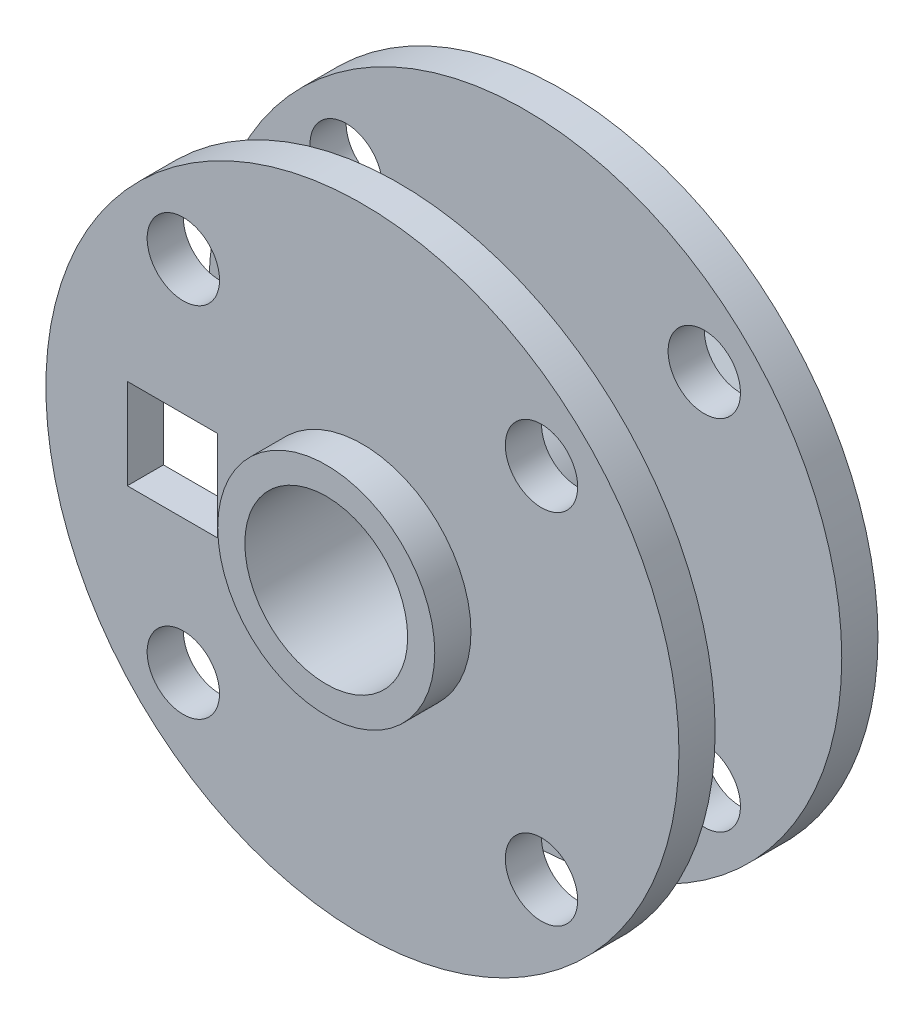
ISO-10303-21;
HEADER;
FILE_DESCRIPTION(('STEP AP214'),'2;1');
FILE_NAME('part.step','',(''),(''),'','','');
FILE_SCHEMA(('AUTOMOTIVE_DESIGN { 1 0 10303 214 1 1 1 1 }'));
ENDSEC;
DATA;
#1=APPLICATION_CONTEXT('core data for automotive mechanical design processes');
#2=APPLICATION_PROTOCOL_DEFINITION('international standard','automotive_design',2000,#1);
#3=PRODUCT_CONTEXT('',#1,'mechanical');
#4=PRODUCT('Part','Part','',(#3));
#5=PRODUCT_RELATED_PRODUCT_CATEGORY('part','',(#4));
#6=PRODUCT_DEFINITION_FORMATION('','',#4);
#7=PRODUCT_DEFINITION_CONTEXT('part definition',#1,'design');
#8=PRODUCT_DEFINITION('design','',#6,#7);
#9=PRODUCT_DEFINITION_SHAPE('','',#8);
#10=(LENGTH_UNIT() NAMED_UNIT(*) SI_UNIT(.MILLI.,.METRE.));
#11=(NAMED_UNIT(*) PLANE_ANGLE_UNIT() SI_UNIT($,.RADIAN.));
#12=(NAMED_UNIT(*) SI_UNIT($,.STERADIAN.) SOLID_ANGLE_UNIT());
#13=UNCERTAINTY_MEASURE_WITH_UNIT(LENGTH_MEASURE(1.E-05),#10,'distance_accuracy_value','');
#14=(GEOMETRIC_REPRESENTATION_CONTEXT(3) GLOBAL_UNCERTAINTY_ASSIGNED_CONTEXT((#13)) GLOBAL_UNIT_ASSIGNED_CONTEXT((#10,
#11,#12)) REPRESENTATION_CONTEXT('',''));
#15=CARTESIAN_POINT('',(0.,0.,0.));
#16=DIRECTION('',(0.,0.,1.));
#17=DIRECTION('',(1.,0.,0.));
#18=AXIS2_PLACEMENT_3D('',#15,#16,#17);
#19=CARTESIAN_POINT('',(0.,0.,0.));
#20=DIRECTION('',(0.,0.,1.));
#21=DIRECTION('',(1.,0.,0.));
#22=AXIS2_PLACEMENT_3D('',#19,#20,#21);
#23=PLANE('',#22);
#24=CARTESIAN_POINT('',(0.,0.,0.));
#25=DIRECTION('',(0.,0.,1.));
#26=DIRECTION('',(1.,0.,0.));
#27=AXIS2_PLACEMENT_3D('',#24,#25,#26);
#28=CIRCLE('',#27,17.5);
#29=CARTESIAN_POINT('',(17.5,0.,0.));
#30=VERTEX_POINT('',#29);
#31=EDGE_CURVE('E270',#30,#30,#28,.T.);
#32=ORIENTED_EDGE('',*,*,#31,.F.);
#33=EDGE_LOOP('',(#32));
#34=FACE_BOUND('',#33,.T.);
#35=DIRECTION('',(-1.,0.,0.));
#36=VECTOR('',#35,1.);
#37=CARTESIAN_POINT('',(0.,2.5,0.));
#38=LINE('',#37,#36);
#39=CARTESIAN_POINT('',(-8.,2.5,0.));
#40=VERTEX_POINT('',#39);
#41=CARTESIAN_POINT('',(-13.,2.5,0.));
#42=VERTEX_POINT('',#41);
#43=EDGE_CURVE('E251',#40,#42,#38,.T.);
#44=ORIENTED_EDGE('',*,*,#43,.T.);
#45=DIRECTION('',(0.,-1.,0.));
#46=VECTOR('',#45,1.);
#47=CARTESIAN_POINT('',(-13.,0.,0.));
#48=LINE('',#47,#46);
#49=CARTESIAN_POINT('',(-13.,-2.5,0.));
#50=VERTEX_POINT('',#49);
#51=EDGE_CURVE('E256',#42,#50,#48,.T.);
#52=ORIENTED_EDGE('',*,*,#51,.T.);
#53=DIRECTION('',(1.,0.,0.));
#54=VECTOR('',#53,1.);
#55=CARTESIAN_POINT('',(0.,-2.5,0.));
#56=LINE('',#55,#54);
#57=CARTESIAN_POINT('',(-8.,-2.5,0.));
#58=VERTEX_POINT('',#57);
#59=EDGE_CURVE('E241',#50,#58,#56,.T.);
#60=ORIENTED_EDGE('',*,*,#59,.T.);
#61=DIRECTION('',(0.,1.,0.));
#62=VECTOR('',#61,1.);
#63=CARTESIAN_POINT('',(-8.,0.,0.));
#64=LINE('',#63,#62);
#65=EDGE_CURVE('E246',#58,#40,#64,.T.);
#66=ORIENTED_EDGE('',*,*,#65,.T.);
#67=EDGE_LOOP('',(#44,#52,#60,#66));
#68=FACE_BOUND('',#67,.T.);
#69=CARTESIAN_POINT('',(-9.89949493661169,9.89949493661164,0.));
#70=DIRECTION('',(0.,0.,1.));
#71=DIRECTION('',(1.,0.,0.));
#72=AXIS2_PLACEMENT_3D('',#69,#70,#71);
#73=CIRCLE('',#72,2.);
#74=CARTESIAN_POINT('',(-7.89949493661168,9.89949493661164,0.));
#75=VERTEX_POINT('',#74);
#76=EDGE_CURVE('E183',#75,#75,#73,.T.);
#77=ORIENTED_EDGE('',*,*,#76,.T.);
#78=EDGE_LOOP('',(#77));
#79=FACE_BOUND('',#78,.T.);
#80=CARTESIAN_POINT('',(9.89949493661165,9.89949493661224,0.));
#81=DIRECTION('',(0.,0.,1.));
#82=DIRECTION('',(1.,0.,0.));
#83=AXIS2_PLACEMENT_3D('',#80,#81,#82);
#84=CIRCLE('',#83,2.00000000000058);
#85=CARTESIAN_POINT('',(11.8994949366122,9.89949493661224,0.));
#86=VERTEX_POINT('',#85);
#87=EDGE_CURVE('E190',#86,#86,#84,.T.);
#88=ORIENTED_EDGE('',*,*,#87,.T.);
#89=EDGE_LOOP('',(#88));
#90=FACE_BOUND('',#89,.T.);
#91=CARTESIAN_POINT('',(9.89949493661224,-9.89949493661109,0.));
#92=DIRECTION('',(0.,0.,1.));
#93=DIRECTION('',(1.,0.,0.));
#94=AXIS2_PLACEMENT_3D('',#91,#92,#93);
#95=CIRCLE('',#94,2.00000000000078);
#96=CARTESIAN_POINT('',(11.899494936613,-9.89949493661109,0.));
#97=VERTEX_POINT('',#96);
#98=EDGE_CURVE('E197',#97,#97,#95,.T.);
#99=ORIENTED_EDGE('',*,*,#98,.T.);
#100=EDGE_LOOP('',(#99));
#101=FACE_BOUND('',#100,.T.);
#102=CARTESIAN_POINT('',(-9.89949493661109,-9.89949493661169,0.));
#103=DIRECTION('',(0.,0.,1.));
#104=DIRECTION('',(1.,0.,0.));
#105=AXIS2_PLACEMENT_3D('',#102,#103,#104);
#106=CIRCLE('',#105,2.0000000000003);
#107=CARTESIAN_POINT('',(-7.89949493661079,-9.89949493661169,0.));
#108=VERTEX_POINT('',#107);
#109=EDGE_CURVE('E204',#108,#108,#106,.T.);
#110=ORIENTED_EDGE('',*,*,#109,.T.);
#111=EDGE_LOOP('',(#110));
#112=FACE_BOUND('',#111,.T.);
#113=CARTESIAN_POINT('',(0.,0.,0.));
#114=DIRECTION('',(0.,0.,1.));
#115=DIRECTION('',(1.,0.,0.));
#116=AXIS2_PLACEMENT_3D('',#113,#114,#115);
#117=CIRCLE('',#116,6.);
#118=CARTESIAN_POINT('',(6.,0.,0.));
#119=VERTEX_POINT('',#118);
#120=EDGE_CURVE('E11',#119,#119,#117,.F.);
#121=ORIENTED_EDGE('',*,*,#120,.F.);
#122=EDGE_LOOP('',(#121));
#123=FACE_BOUND('',#122,.T.);
#124=ADVANCED_FACE('F36',(#34,#68,#79,#90,#101,#112,#123),#23,.F.);
#125=CARTESIAN_POINT('',(0.,0.,11.));
#126=DIRECTION('',(0.,0.,1.));
#127=DIRECTION('',(1.,0.,0.));
#128=AXIS2_PLACEMENT_3D('',#125,#126,#127);
#129=PLANE('',#128);
#130=CARTESIAN_POINT('',(-9.89949493661109,-9.89949493661169,11.));
#131=DIRECTION('',(0.,0.,1.));
#132=DIRECTION('',(1.,0.,0.));
#133=AXIS2_PLACEMENT_3D('',#130,#131,#132);
#134=CIRCLE('',#133,2.0000000000003);
#135=CARTESIAN_POINT('',(-7.89949493661079,-9.89949493661169,11.));
#136=VERTEX_POINT('',#135);
#137=EDGE_CURVE('E165',#136,#136,#134,.T.);
#138=ORIENTED_EDGE('',*,*,#137,.F.);
#139=EDGE_LOOP('',(#138));
#140=FACE_BOUND('',#139,.T.);
#141=CARTESIAN_POINT('',(9.89949493661224,-9.89949493661109,11.));
#142=DIRECTION('',(0.,0.,1.));
#143=DIRECTION('',(1.,0.,0.));
#144=AXIS2_PLACEMENT_3D('',#141,#142,#143);
#145=CIRCLE('',#144,2.00000000000078);
#146=CARTESIAN_POINT('',(11.899494936613,-9.89949493661109,11.));
#147=VERTEX_POINT('',#146);
#148=EDGE_CURVE('E175',#147,#147,#145,.T.);
#149=ORIENTED_EDGE('',*,*,#148,.F.);
#150=EDGE_LOOP('',(#149));
#151=FACE_BOUND('',#150,.T.);
#152=CARTESIAN_POINT('',(9.89949493661165,9.89949493661224,11.));
#153=DIRECTION('',(0.,0.,1.));
#154=DIRECTION('',(1.,0.,0.));
#155=AXIS2_PLACEMENT_3D('',#152,#153,#154);
#156=CIRCLE('',#155,2.00000000000058);
#157=CARTESIAN_POINT('',(11.8994949366122,9.89949493661224,11.));
#158=VERTEX_POINT('',#157);
#159=EDGE_CURVE('E171',#158,#158,#156,.T.);
#160=ORIENTED_EDGE('',*,*,#159,.F.);
#161=EDGE_LOOP('',(#160));
#162=FACE_BOUND('',#161,.T.);
#163=CARTESIAN_POINT('',(-9.89949493661169,9.89949493661164,11.));
#164=DIRECTION('',(0.,0.,1.));
#165=DIRECTION('',(1.,0.,0.));
#166=AXIS2_PLACEMENT_3D('',#163,#164,#165);
#167=CIRCLE('',#166,2.);
#168=CARTESIAN_POINT('',(-7.89949493661168,9.89949493661164,11.));
#169=VERTEX_POINT('',#168);
#170=EDGE_CURVE('E174',#169,#169,#167,.T.);
#171=ORIENTED_EDGE('',*,*,#170,.F.);
#172=EDGE_LOOP('',(#171));
#173=FACE_BOUND('',#172,.T.);
#174=CARTESIAN_POINT('',(0.,0.,11.));
#175=DIRECTION('',(0.,0.,1.));
#176=DIRECTION('',(1.,0.,0.));
#177=AXIS2_PLACEMENT_3D('',#174,#175,#176);
#178=CIRCLE('',#177,17.5);
#179=CARTESIAN_POINT('',(17.5,0.,11.));
#180=VERTEX_POINT('',#179);
#181=EDGE_CURVE('E262',#180,#180,#178,.T.);
#182=ORIENTED_EDGE('',*,*,#181,.T.);
#183=EDGE_LOOP('',(#182));
#184=FACE_BOUND('',#183,.T.);
#185=DIRECTION('',(0.,-1.,0.));
#186=VECTOR('',#185,1.);
#187=CARTESIAN_POINT('',(-13.,2.5,11.));
#188=LINE('',#187,#186);
#189=CARTESIAN_POINT('',(-13.,2.5,11.));
#190=VERTEX_POINT('',#189);
#191=CARTESIAN_POINT('',(-13.,-2.5,11.));
#192=VERTEX_POINT('',#191);
#193=EDGE_CURVE('E217',#190,#192,#188,.T.);
#194=ORIENTED_EDGE('',*,*,#193,.F.);
#195=DIRECTION('',(-1.,0.,0.));
#196=VECTOR('',#195,1.);
#197=CARTESIAN_POINT('',(-13.,2.5,11.));
#198=LINE('',#197,#196);
#199=CARTESIAN_POINT('',(-8.,2.5,11.));
#200=VERTEX_POINT('',#199);
#201=EDGE_CURVE('E227',#200,#190,#198,.T.);
#202=ORIENTED_EDGE('',*,*,#201,.F.);
#203=DIRECTION('',(0.,1.,0.));
#204=VECTOR('',#203,1.);
#205=CARTESIAN_POINT('',(-8.,2.5,11.));
#206=LINE('',#205,#204);
#207=CARTESIAN_POINT('',(-8.,-2.5,11.));
#208=VERTEX_POINT('',#207);
#209=EDGE_CURVE('E224',#208,#200,#206,.T.);
#210=ORIENTED_EDGE('',*,*,#209,.F.);
#211=DIRECTION('',(1.,0.,0.));
#212=VECTOR('',#211,1.);
#213=CARTESIAN_POINT('',(-13.,-2.5,11.));
#214=LINE('',#213,#212);
#215=EDGE_CURVE('E221',#192,#208,#214,.T.);
#216=ORIENTED_EDGE('',*,*,#215,.F.);
#217=EDGE_LOOP('',(#194,#202,#210,#216));
#218=FACE_BOUND('',#217,.T.);
#219=CARTESIAN_POINT('',(0.,0.,11.));
#220=DIRECTION('',(0.,0.,1.));
#221=DIRECTION('',(1.,0.,0.));
#222=AXIS2_PLACEMENT_3D('',#219,#220,#221);
#223=CIRCLE('',#222,6.);
#224=CARTESIAN_POINT('',(6.,0.,11.));
#225=VERTEX_POINT('',#224);
#226=EDGE_CURVE('E213',#225,#225,#223,.T.);
#227=ORIENTED_EDGE('',*,*,#226,.F.);
#228=EDGE_LOOP('',(#227));
#229=FACE_BOUND('',#228,.T.);
#230=ADVANCED_FACE('F324',(#140,#151,#162,#173,#184,#218,#229),#129,.T.);
#231=CARTESIAN_POINT('',(0.,0.,2.));
#232=DIRECTION('',(0.,0.,-1.));
#233=DIRECTION('',(-1.,0.,0.));
#234=AXIS2_PLACEMENT_3D('',#231,#232,#233);
#235=CYLINDRICAL_SURFACE('',#234,17.5);
#236=CARTESIAN_POINT('',(0.,0.,2.));
#237=DIRECTION('',(0.,0.,1.));
#238=DIRECTION('',(1.,0.,0.));
#239=AXIS2_PLACEMENT_3D('',#236,#237,#238);
#240=CIRCLE('',#239,17.5);
#241=CARTESIAN_POINT('',(17.5,0.,2.));
#242=VERTEX_POINT('',#241);
#243=EDGE_CURVE('E275',#242,#242,#240,.T.);
#244=ORIENTED_EDGE('',*,*,#243,.F.);
#245=EDGE_LOOP('',(#244));
#246=FACE_BOUND('',#245,.T.);
#247=ORIENTED_EDGE('',*,*,#31,.T.);
#248=EDGE_LOOP('',(#247));
#249=FACE_BOUND('',#248,.T.);
#250=ADVANCED_FACE('F38',(#246,#249),#235,.T.);
#251=CARTESIAN_POINT('',(0.,0.,2.));
#252=DIRECTION('',(0.,0.,1.));
#253=DIRECTION('',(1.,0.,0.));
#254=AXIS2_PLACEMENT_3D('',#251,#252,#253);
#255=PLANE('',#254);
#256=CARTESIAN_POINT('',(-9.89949493661109,-9.89949493661169,2.));
#257=DIRECTION('',(0.,0.,1.));
#258=DIRECTION('',(1.,0.,0.));
#259=AXIS2_PLACEMENT_3D('',#256,#257,#258);
#260=CIRCLE('',#259,2.0000000000003);
#261=CARTESIAN_POINT('',(-7.89949493661079,-9.89949493661169,2.));
#262=VERTEX_POINT('',#261);
#263=EDGE_CURVE('E207',#262,#262,#260,.T.);
#264=ORIENTED_EDGE('',*,*,#263,.F.);
#265=EDGE_LOOP('',(#264));
#266=FACE_BOUND('',#265,.T.);
#267=CARTESIAN_POINT('',(9.89949493661224,-9.89949493661109,2.));
#268=DIRECTION('',(0.,0.,1.));
#269=DIRECTION('',(1.,0.,0.));
#270=AXIS2_PLACEMENT_3D('',#267,#268,#269);
#271=CIRCLE('',#270,2.00000000000078);
#272=CARTESIAN_POINT('',(11.899494936613,-9.89949493661109,2.));
#273=VERTEX_POINT('',#272);
#274=EDGE_CURVE('E200',#273,#273,#271,.T.);
#275=ORIENTED_EDGE('',*,*,#274,.F.);
#276=EDGE_LOOP('',(#275));
#277=FACE_BOUND('',#276,.T.);
#278=CARTESIAN_POINT('',(9.89949493661165,9.89949493661224,2.));
#279=DIRECTION('',(0.,0.,1.));
#280=DIRECTION('',(1.,0.,0.));
#281=AXIS2_PLACEMENT_3D('',#278,#279,#280);
#282=CIRCLE('',#281,2.00000000000058);
#283=CARTESIAN_POINT('',(11.8994949366122,9.89949493661224,2.));
#284=VERTEX_POINT('',#283);
#285=EDGE_CURVE('E193',#284,#284,#282,.T.);
#286=ORIENTED_EDGE('',*,*,#285,.F.);
#287=EDGE_LOOP('',(#286));
#288=FACE_BOUND('',#287,.T.);
#289=CARTESIAN_POINT('',(-9.89949493661169,9.89949493661164,2.));
#290=DIRECTION('',(0.,0.,1.));
#291=DIRECTION('',(1.,0.,0.));
#292=AXIS2_PLACEMENT_3D('',#289,#290,#291);
#293=CIRCLE('',#292,2.);
#294=CARTESIAN_POINT('',(-7.89949493661168,9.89949493661164,2.));
#295=VERTEX_POINT('',#294);
#296=EDGE_CURVE('E186',#295,#295,#293,.T.);
#297=ORIENTED_EDGE('',*,*,#296,.F.);
#298=EDGE_LOOP('',(#297));
#299=FACE_BOUND('',#298,.T.);
#300=DIRECTION('',(0.,-1.,0.));
#301=VECTOR('',#300,1.);
#302=CARTESIAN_POINT('',(-13.,0.,2.));
#303=LINE('',#302,#301);
#304=CARTESIAN_POINT('',(-13.,2.5,2.));
#305=VERTEX_POINT('',#304);
#306=CARTESIAN_POINT('',(-13.,-2.5,2.));
#307=VERTEX_POINT('',#306);
#308=EDGE_CURVE('E259',#305,#307,#303,.T.);
#309=ORIENTED_EDGE('',*,*,#308,.F.);
#310=DIRECTION('',(-1.,0.,0.));
#311=VECTOR('',#310,1.);
#312=CARTESIAN_POINT('',(0.,2.5,2.));
#313=LINE('',#312,#311);
#314=CARTESIAN_POINT('',(-8.,2.5,2.));
#315=VERTEX_POINT('',#314);
#316=EDGE_CURVE('E254',#315,#305,#313,.T.);
#317=ORIENTED_EDGE('',*,*,#316,.F.);
#318=DIRECTION('',(0.,1.,0.));
#319=VECTOR('',#318,1.);
#320=CARTESIAN_POINT('',(-8.,0.,2.));
#321=LINE('',#320,#319);
#322=CARTESIAN_POINT('',(-8.,-2.5,2.));
#323=VERTEX_POINT('',#322);
#324=EDGE_CURVE('E249',#323,#315,#321,.T.);
#325=ORIENTED_EDGE('',*,*,#324,.F.);
#326=DIRECTION('',(1.,0.,0.));
#327=VECTOR('',#326,1.);
#328=CARTESIAN_POINT('',(0.,-2.5,2.));
#329=LINE('',#328,#327);
#330=EDGE_CURVE('E244',#307,#323,#329,.T.);
#331=ORIENTED_EDGE('',*,*,#330,.F.);
#332=EDGE_LOOP('',(#309,#317,#325,#331));
#333=FACE_BOUND('',#332,.T.);
#334=CARTESIAN_POINT('',(0.,0.,2.));
#335=DIRECTION('',(0.,0.,1.));
#336=DIRECTION('',(1.,0.,0.));
#337=AXIS2_PLACEMENT_3D('',#334,#335,#336);
#338=CIRCLE('',#337,7.);
#339=CARTESIAN_POINT('',(7.,0.,2.));
#340=VERTEX_POINT('',#339);
#341=EDGE_CURVE('E271',#340,#340,#338,.T.);
#342=ORIENTED_EDGE('',*,*,#341,.F.);
#343=EDGE_LOOP('',(#342));
#344=FACE_BOUND('',#343,.T.);
#345=ORIENTED_EDGE('',*,*,#243,.T.);
#346=EDGE_LOOP('',(#345));
#347=FACE_BOUND('',#346,.T.);
#348=ADVANCED_FACE('F334',(#266,#277,#288,#299,#333,#344,#347),#255,.T.);
#349=CARTESIAN_POINT('',(0.,0.,9.));
#350=DIRECTION('',(0.,0.,-1.));
#351=DIRECTION('',(-1.,0.,0.));
#352=AXIS2_PLACEMENT_3D('',#349,#350,#351);
#353=CYLINDRICAL_SURFACE('',#352,7.);
#354=CARTESIAN_POINT('',(0.,0.,9.));
#355=DIRECTION('',(0.,0.,1.));
#356=DIRECTION('',(1.,0.,0.));
#357=AXIS2_PLACEMENT_3D('',#354,#355,#356);
#358=CIRCLE('',#357,7.);
#359=CARTESIAN_POINT('',(7.,0.,9.));
#360=VERTEX_POINT('',#359);
#361=EDGE_CURVE('E265',#360,#360,#358,.T.);
#362=ORIENTED_EDGE('',*,*,#361,.F.);
#363=EDGE_LOOP('',(#362));
#364=FACE_BOUND('',#363,.T.);
#365=ORIENTED_EDGE('',*,*,#341,.T.);
#366=EDGE_LOOP('',(#365));
#367=FACE_BOUND('',#366,.T.);
#368=ADVANCED_FACE('F337',(#364,#367),#353,.T.);
#369=CARTESIAN_POINT('',(0.,0.,11.));
#370=DIRECTION('',(0.,0.,-1.));
#371=DIRECTION('',(-1.,0.,0.));
#372=AXIS2_PLACEMENT_3D('',#369,#370,#371);
#373=CYLINDRICAL_SURFACE('',#372,17.5);
#374=ORIENTED_EDGE('',*,*,#181,.F.);
#375=EDGE_LOOP('',(#374));
#376=FACE_BOUND('',#375,.T.);
#377=CARTESIAN_POINT('',(0.,0.,9.));
#378=DIRECTION('',(0.,0.,1.));
#379=DIRECTION('',(1.,0.,0.));
#380=AXIS2_PLACEMENT_3D('',#377,#378,#379);
#381=CIRCLE('',#380,17.5);
#382=CARTESIAN_POINT('',(17.5,0.,9.));
#383=VERTEX_POINT('',#382);
#384=EDGE_CURVE('E261',#383,#383,#381,.T.);
#385=ORIENTED_EDGE('',*,*,#384,.T.);
#386=EDGE_LOOP('',(#385));
#387=FACE_BOUND('',#386,.T.);
#388=ADVANCED_FACE('F341',(#376,#387),#373,.T.);
#389=CARTESIAN_POINT('',(0.,0.,9.));
#390=DIRECTION('',(0.,0.,1.));
#391=DIRECTION('',(1.,0.,0.));
#392=AXIS2_PLACEMENT_3D('',#389,#390,#391);
#393=PLANE('',#392);
#394=CARTESIAN_POINT('',(-9.89949493661109,-9.89949493661169,9.));
#395=DIRECTION('',(0.,0.,1.));
#396=DIRECTION('',(1.,0.,0.));
#397=AXIS2_PLACEMENT_3D('',#394,#395,#396);
#398=CIRCLE('',#397,2.0000000000003);
#399=CARTESIAN_POINT('',(-7.89949493661079,-9.89949493661169,9.));
#400=VERTEX_POINT('',#399);
#401=EDGE_CURVE('E203',#400,#400,#398,.T.);
#402=ORIENTED_EDGE('',*,*,#401,.T.);
#403=EDGE_LOOP('',(#402));
#404=FACE_BOUND('',#403,.T.);
#405=CARTESIAN_POINT('',(9.89949493661224,-9.89949493661109,9.));
#406=DIRECTION('',(0.,0.,1.));
#407=DIRECTION('',(1.,0.,0.));
#408=AXIS2_PLACEMENT_3D('',#405,#406,#407);
#409=CIRCLE('',#408,2.00000000000078);
#410=CARTESIAN_POINT('',(11.899494936613,-9.89949493661109,9.));
#411=VERTEX_POINT('',#410);
#412=EDGE_CURVE('E196',#411,#411,#409,.T.);
#413=ORIENTED_EDGE('',*,*,#412,.T.);
#414=EDGE_LOOP('',(#413));
#415=FACE_BOUND('',#414,.T.);
#416=CARTESIAN_POINT('',(9.89949493661165,9.89949493661224,9.));
#417=DIRECTION('',(0.,0.,1.));
#418=DIRECTION('',(1.,0.,0.));
#419=AXIS2_PLACEMENT_3D('',#416,#417,#418);
#420=CIRCLE('',#419,2.00000000000058);
#421=CARTESIAN_POINT('',(11.8994949366122,9.89949493661224,9.));
#422=VERTEX_POINT('',#421);
#423=EDGE_CURVE('E189',#422,#422,#420,.T.);
#424=ORIENTED_EDGE('',*,*,#423,.T.);
#425=EDGE_LOOP('',(#424));
#426=FACE_BOUND('',#425,.T.);
#427=CARTESIAN_POINT('',(-9.89949493661169,9.89949493661164,9.));
#428=DIRECTION('',(0.,0.,1.));
#429=DIRECTION('',(1.,0.,0.));
#430=AXIS2_PLACEMENT_3D('',#427,#428,#429);
#431=CIRCLE('',#430,2.);
#432=CARTESIAN_POINT('',(-7.89949493661168,9.89949493661164,9.));
#433=VERTEX_POINT('',#432);
#434=EDGE_CURVE('E182',#433,#433,#431,.T.);
#435=ORIENTED_EDGE('',*,*,#434,.T.);
#436=EDGE_LOOP('',(#435));
#437=FACE_BOUND('',#436,.T.);
#438=DIRECTION('',(-1.,0.,0.));
#439=VECTOR('',#438,1.);
#440=CARTESIAN_POINT('',(0.,2.5,9.));
#441=LINE('',#440,#439);
#442=CARTESIAN_POINT('',(-8.,2.5,9.));
#443=VERTEX_POINT('',#442);
#444=CARTESIAN_POINT('',(-13.,2.5,9.));
#445=VERTEX_POINT('',#444);
#446=EDGE_CURVE('E285',#443,#445,#441,.T.);
#447=ORIENTED_EDGE('',*,*,#446,.T.);
#448=DIRECTION('',(0.,-1.,0.));
#449=VECTOR('',#448,1.);
#450=CARTESIAN_POINT('',(-13.,0.,9.));
#451=LINE('',#450,#449);
#452=CARTESIAN_POINT('',(-13.,-2.5,9.));
#453=VERTEX_POINT('',#452);
#454=EDGE_CURVE('E44',#445,#453,#451,.T.);
#455=ORIENTED_EDGE('',*,*,#454,.T.);
#456=DIRECTION('',(1.,0.,0.));
#457=VECTOR('',#456,1.);
#458=CARTESIAN_POINT('',(0.,-2.5,9.));
#459=LINE('',#458,#457);
#460=CARTESIAN_POINT('',(-8.,-2.5,9.));
#461=VERTEX_POINT('',#460);
#462=EDGE_CURVE('E274',#453,#461,#459,.T.);
#463=ORIENTED_EDGE('',*,*,#462,.T.);
#464=DIRECTION('',(0.,1.,0.));
#465=VECTOR('',#464,1.);
#466=CARTESIAN_POINT('',(-8.,0.,9.));
#467=LINE('',#466,#465);
#468=EDGE_CURVE('E282',#461,#443,#467,.T.);
#469=ORIENTED_EDGE('',*,*,#468,.T.);
#470=EDGE_LOOP('',(#447,#455,#463,#469));
#471=FACE_BOUND('',#470,.T.);
#472=ORIENTED_EDGE('',*,*,#361,.T.);
#473=EDGE_LOOP('',(#472));
#474=FACE_BOUND('',#473,.T.);
#475=ORIENTED_EDGE('',*,*,#384,.F.);
#476=EDGE_LOOP('',(#475));
#477=FACE_BOUND('',#476,.T.);
#478=ADVANCED_FACE('F298',(#404,#415,#426,#437,#471,#474,#477),#393,.F.);
#479=CARTESIAN_POINT('',(-13.,-2.5,-7.));
#480=DIRECTION('',(0.,-1.,0.));
#481=DIRECTION('',(1.,0.,0.));
#482=AXIS2_PLACEMENT_3D('',#479,#480,#481);
#483=PLANE('',#482);
#484=DIRECTION('',(0.,0.,1.));
#485=VECTOR('',#484,1.);
#486=CARTESIAN_POINT('',(-13.,-2.5,-7.));
#487=LINE('',#486,#485);
#488=EDGE_CURVE('E230',#453,#192,#487,.T.);
#489=ORIENTED_EDGE('',*,*,#488,.T.);
#490=ORIENTED_EDGE('',*,*,#215,.T.);
#491=DIRECTION('',(0.,0.,1.));
#492=VECTOR('',#491,1.);
#493=CARTESIAN_POINT('',(-8.,-2.5,-7.));
#494=LINE('',#493,#492);
#495=EDGE_CURVE('E237',#461,#208,#494,.T.);
#496=ORIENTED_EDGE('',*,*,#495,.F.);
#497=ORIENTED_EDGE('',*,*,#462,.F.);
#498=EDGE_LOOP('',(#489,#490,#496,#497));
#499=FACE_BOUND('',#498,.T.);
#500=ADVANCED_FACE('F347',(#499),#483,.F.);
#501=CARTESIAN_POINT('',(-8.,2.5,-7.));
#502=DIRECTION('',(1.,0.,0.));
#503=DIRECTION('',(0.,0.,-1.));
#504=AXIS2_PLACEMENT_3D('',#501,#502,#503);
#505=PLANE('',#504);
#506=ORIENTED_EDGE('',*,*,#495,.T.);
#507=ORIENTED_EDGE('',*,*,#209,.T.);
#508=DIRECTION('',(0.,0.,1.));
#509=VECTOR('',#508,1.);
#510=CARTESIAN_POINT('',(-8.,2.5,-7.));
#511=LINE('',#510,#509);
#512=EDGE_CURVE('E235',#443,#200,#511,.T.);
#513=ORIENTED_EDGE('',*,*,#512,.F.);
#514=ORIENTED_EDGE('',*,*,#468,.F.);
#515=EDGE_LOOP('',(#506,#507,#513,#514));
#516=FACE_BOUND('',#515,.T.);
#517=ADVANCED_FACE('F363',(#516),#505,.F.);
#518=CARTESIAN_POINT('',(-13.,2.5,-7.));
#519=DIRECTION('',(0.,1.,0.));
#520=DIRECTION('',(0.,0.,1.));
#521=AXIS2_PLACEMENT_3D('',#518,#519,#520);
#522=PLANE('',#521);
#523=ORIENTED_EDGE('',*,*,#512,.T.);
#524=ORIENTED_EDGE('',*,*,#201,.T.);
#525=DIRECTION('',(0.,0.,1.));
#526=VECTOR('',#525,1.);
#527=CARTESIAN_POINT('',(-13.,2.5,-7.));
#528=LINE('',#527,#526);
#529=EDGE_CURVE('E231',#445,#190,#528,.T.);
#530=ORIENTED_EDGE('',*,*,#529,.F.);
#531=ORIENTED_EDGE('',*,*,#446,.F.);
#532=EDGE_LOOP('',(#523,#524,#530,#531));
#533=FACE_BOUND('',#532,.T.);
#534=ADVANCED_FACE('F367',(#533),#522,.F.);
#535=CARTESIAN_POINT('',(-13.,2.5,-7.));
#536=DIRECTION('',(-1.,0.,0.));
#537=DIRECTION('',(0.,0.,1.));
#538=AXIS2_PLACEMENT_3D('',#535,#536,#537);
#539=PLANE('',#538);
#540=ORIENTED_EDGE('',*,*,#529,.T.);
#541=ORIENTED_EDGE('',*,*,#193,.T.);
#542=ORIENTED_EDGE('',*,*,#488,.F.);
#543=ORIENTED_EDGE('',*,*,#454,.F.);
#544=EDGE_LOOP('',(#540,#541,#542,#543));
#545=FACE_BOUND('',#544,.T.);
#546=ADVANCED_FACE('F353',(#545),#539,.F.);
#547=ORIENTED_EDGE('',*,*,#308,.T.);
#548=EDGE_CURVE('E51',#50,#307,#487,.T.);
#549=ORIENTED_EDGE('',*,*,#548,.F.);
#550=ORIENTED_EDGE('',*,*,#51,.F.);
#551=EDGE_CURVE('E233',#42,#305,#528,.T.);
#552=ORIENTED_EDGE('',*,*,#551,.T.);
#553=EDGE_LOOP('',(#547,#549,#550,#552));
#554=FACE_BOUND('',#553,.T.);
#555=ADVANCED_FACE('F349',(#554),#539,.F.);
#556=ORIENTED_EDGE('',*,*,#316,.T.);
#557=ORIENTED_EDGE('',*,*,#551,.F.);
#558=ORIENTED_EDGE('',*,*,#43,.F.);
#559=EDGE_CURVE('E234',#40,#315,#511,.T.);
#560=ORIENTED_EDGE('',*,*,#559,.T.);
#561=EDGE_LOOP('',(#556,#557,#558,#560));
#562=FACE_BOUND('',#561,.T.);
#563=ADVANCED_FACE('F352',(#562),#522,.F.);
#564=ORIENTED_EDGE('',*,*,#324,.T.);
#565=ORIENTED_EDGE('',*,*,#559,.F.);
#566=ORIENTED_EDGE('',*,*,#65,.F.);
#567=EDGE_CURVE('E56',#58,#323,#494,.T.);
#568=ORIENTED_EDGE('',*,*,#567,.T.);
#569=EDGE_LOOP('',(#564,#565,#566,#568));
#570=FACE_BOUND('',#569,.T.);
#571=ADVANCED_FACE('F359',(#570),#505,.F.);
#572=ORIENTED_EDGE('',*,*,#330,.T.);
#573=ORIENTED_EDGE('',*,*,#567,.F.);
#574=ORIENTED_EDGE('',*,*,#59,.F.);
#575=ORIENTED_EDGE('',*,*,#548,.T.);
#576=EDGE_LOOP('',(#572,#573,#574,#575));
#577=FACE_BOUND('',#576,.T.);
#578=ADVANCED_FACE('F355',(#577),#483,.F.);
#579=CARTESIAN_POINT('',(0.,0.,18.));
#580=DIRECTION('',(0.,0.,-1.));
#581=DIRECTION('',(-1.,0.,0.));
#582=AXIS2_PLACEMENT_3D('',#579,#580,#581);
#583=CYLINDRICAL_SURFACE('',#582,4.5);
#584=CARTESIAN_POINT('',(0.,0.,13.));
#585=DIRECTION('',(0.,0.,1.));
#586=DIRECTION('',(1.,0.,0.));
#587=AXIS2_PLACEMENT_3D('',#584,#585,#586);
#588=CIRCLE('',#587,4.5);
#589=CARTESIAN_POINT('',(4.5,0.,13.));
#590=VERTEX_POINT('',#589);
#591=EDGE_CURVE('E210',#590,#590,#588,.T.);
#592=ORIENTED_EDGE('',*,*,#591,.T.);
#593=EDGE_LOOP('',(#592));
#594=FACE_BOUND('',#593,.T.);
#595=CARTESIAN_POINT('',(0.,0.,-5.));
#596=DIRECTION('',(0.,0.,-1.));
#597=DIRECTION('',(-1.,0.,0.));
#598=AXIS2_PLACEMENT_3D('',#595,#596,#597);
#599=CIRCLE('',#598,4.5);
#600=CARTESIAN_POINT('',(-4.5,0.,-5.));
#601=VERTEX_POINT('',#600);
#602=EDGE_CURVE('E386',#601,#601,#599,.T.);
#603=ORIENTED_EDGE('',*,*,#602,.T.);
#604=EDGE_LOOP('',(#603));
#605=FACE_BOUND('',#604,.T.);
#606=ADVANCED_FACE('F358',(#594,#605),#583,.F.);
#607=CARTESIAN_POINT('',(0.,0.,13.));
#608=DIRECTION('',(0.,0.,1.));
#609=DIRECTION('',(1.,0.,0.));
#610=AXIS2_PLACEMENT_3D('',#607,#608,#609);
#611=PLANE('',#610);
#612=CARTESIAN_POINT('',(0.,0.,13.));
#613=DIRECTION('',(0.,0.,1.));
#614=DIRECTION('',(1.,0.,0.));
#615=AXIS2_PLACEMENT_3D('',#612,#613,#614);
#616=CIRCLE('',#615,6.);
#617=CARTESIAN_POINT('',(6.,0.,13.));
#618=VERTEX_POINT('',#617);
#619=EDGE_CURVE('E214',#618,#618,#616,.T.);
#620=ORIENTED_EDGE('',*,*,#619,.T.);
#621=EDGE_LOOP('',(#620));
#622=FACE_BOUND('',#621,.T.);
#623=ORIENTED_EDGE('',*,*,#591,.F.);
#624=EDGE_LOOP('',(#623));
#625=FACE_BOUND('',#624,.T.);
#626=ADVANCED_FACE('F370',(#622,#625),#611,.T.);
#627=CARTESIAN_POINT('',(0.,0.,13.));
#628=DIRECTION('',(0.,0.,-1.));
#629=DIRECTION('',(-1.,0.,0.));
#630=AXIS2_PLACEMENT_3D('',#627,#628,#629);
#631=CYLINDRICAL_SURFACE('',#630,6.);
#632=ORIENTED_EDGE('',*,*,#619,.F.);
#633=EDGE_LOOP('',(#632));
#634=FACE_BOUND('',#633,.T.);
#635=ORIENTED_EDGE('',*,*,#226,.T.);
#636=EDGE_LOOP('',(#635));
#637=FACE_BOUND('',#636,.T.);
#638=ADVANCED_FACE('F372',(#634,#637),#631,.T.);
#639=CARTESIAN_POINT('',(-9.89949493661169,9.89949493661164,-9.));
#640=DIRECTION('',(0.,0.,1.));
#641=DIRECTION('',(1.,0.,0.));
#642=AXIS2_PLACEMENT_3D('',#639,#640,#641);
#643=CYLINDRICAL_SURFACE('',#642,2.);
#644=ORIENTED_EDGE('',*,*,#170,.T.);
#645=EDGE_LOOP('',(#644));
#646=FACE_BOUND('',#645,.T.);
#647=ORIENTED_EDGE('',*,*,#434,.F.);
#648=EDGE_LOOP('',(#647));
#649=FACE_BOUND('',#648,.T.);
#650=ADVANCED_FACE('F315',(#646,#649),#643,.F.);
#651=CARTESIAN_POINT('',(9.89949493661165,9.89949493661224,-9.));
#652=DIRECTION('',(0.,0.,1.));
#653=DIRECTION('',(1.,0.,0.));
#654=AXIS2_PLACEMENT_3D('',#651,#652,#653);
#655=CYLINDRICAL_SURFACE('',#654,2.00000000000058);
#656=ORIENTED_EDGE('',*,*,#159,.T.);
#657=EDGE_LOOP('',(#656));
#658=FACE_BOUND('',#657,.T.);
#659=ORIENTED_EDGE('',*,*,#423,.F.);
#660=EDGE_LOOP('',(#659));
#661=FACE_BOUND('',#660,.T.);
#662=ADVANCED_FACE('F316',(#658,#661),#655,.F.);
#663=CARTESIAN_POINT('',(9.89949493661224,-9.89949493661109,-9.));
#664=DIRECTION('',(0.,0.,1.));
#665=DIRECTION('',(1.,0.,0.));
#666=AXIS2_PLACEMENT_3D('',#663,#664,#665);
#667=CYLINDRICAL_SURFACE('',#666,2.00000000000078);
#668=ORIENTED_EDGE('',*,*,#148,.T.);
#669=EDGE_LOOP('',(#668));
#670=FACE_BOUND('',#669,.T.);
#671=ORIENTED_EDGE('',*,*,#412,.F.);
#672=EDGE_LOOP('',(#671));
#673=FACE_BOUND('',#672,.T.);
#674=ADVANCED_FACE('F304',(#670,#673),#667,.F.);
#675=CARTESIAN_POINT('',(-9.89949493661109,-9.89949493661169,-9.));
#676=DIRECTION('',(0.,0.,1.));
#677=DIRECTION('',(1.,0.,0.));
#678=AXIS2_PLACEMENT_3D('',#675,#676,#677);
#679=CYLINDRICAL_SURFACE('',#678,2.0000000000003);
#680=ORIENTED_EDGE('',*,*,#137,.T.);
#681=EDGE_LOOP('',(#680));
#682=FACE_BOUND('',#681,.T.);
#683=ORIENTED_EDGE('',*,*,#401,.F.);
#684=EDGE_LOOP('',(#683));
#685=FACE_BOUND('',#684,.T.);
#686=ADVANCED_FACE('F301',(#682,#685),#679,.F.);
#687=ORIENTED_EDGE('',*,*,#296,.T.);
#688=EDGE_LOOP('',(#687));
#689=FACE_BOUND('',#688,.T.);
#690=ORIENTED_EDGE('',*,*,#76,.F.);
#691=EDGE_LOOP('',(#690));
#692=FACE_BOUND('',#691,.T.);
#693=ADVANCED_FACE('F303',(#689,#692),#643,.F.);
#694=ORIENTED_EDGE('',*,*,#285,.T.);
#695=EDGE_LOOP('',(#694));
#696=FACE_BOUND('',#695,.T.);
#697=ORIENTED_EDGE('',*,*,#87,.F.);
#698=EDGE_LOOP('',(#697));
#699=FACE_BOUND('',#698,.T.);
#700=ADVANCED_FACE('F312',(#696,#699),#655,.F.);
#701=ORIENTED_EDGE('',*,*,#274,.T.);
#702=EDGE_LOOP('',(#701));
#703=FACE_BOUND('',#702,.T.);
#704=ORIENTED_EDGE('',*,*,#98,.F.);
#705=EDGE_LOOP('',(#704));
#706=FACE_BOUND('',#705,.T.);
#707=ADVANCED_FACE('F319',(#703,#706),#667,.F.);
#708=ORIENTED_EDGE('',*,*,#263,.T.);
#709=EDGE_LOOP('',(#708));
#710=FACE_BOUND('',#709,.T.);
#711=ORIENTED_EDGE('',*,*,#109,.F.);
#712=EDGE_LOOP('',(#711));
#713=FACE_BOUND('',#712,.T.);
#714=ADVANCED_FACE('F307',(#710,#713),#679,.F.);
#715=CARTESIAN_POINT('',(0.,0.,-2.));
#716=DIRECTION('',(0.,0.,1.));
#717=DIRECTION('',(1.,0.,0.));
#718=AXIS2_PLACEMENT_3D('',#715,#716,#717);
#719=CYLINDRICAL_SURFACE('',#718,6.);
#720=CARTESIAN_POINT('',(0.,0.,-2.));
#721=DIRECTION('',(0.,0.,-1.));
#722=DIRECTION('',(-1.,0.,0.));
#723=AXIS2_PLACEMENT_3D('',#720,#721,#722);
#724=CIRCLE('',#723,6.);
#725=CARTESIAN_POINT('',(-6.,0.,-2.));
#726=VERTEX_POINT('',#725);
#727=EDGE_CURVE('E162',#726,#726,#724,.T.);
#728=ORIENTED_EDGE('',*,*,#727,.F.);
#729=EDGE_LOOP('',(#728));
#730=FACE_BOUND('',#729,.T.);
#731=ORIENTED_EDGE('',*,*,#120,.T.);
#732=EDGE_LOOP('',(#731));
#733=FACE_BOUND('',#732,.T.);
#734=ADVANCED_FACE('F321',(#730,#733),#719,.T.);
#735=CARTESIAN_POINT('',(0.,0.,-5.));
#736=DIRECTION('',(0.,0.,-1.));
#737=DIRECTION('',(-1.,0.,0.));
#738=AXIS2_PLACEMENT_3D('',#735,#736,#737);
#739=PLANE('',#738);
#740=DIRECTION('',(0.866025403784439,0.5,0.));
#741=VECTOR('',#740,1.);
#742=CARTESIAN_POINT('',(-7.,4.04145188432738,-5.));
#743=LINE('',#742,#741);
#744=CARTESIAN_POINT('',(-7.,4.04145188432738,-5.));
#745=VERTEX_POINT('',#744);
#746=CARTESIAN_POINT('',(0.,8.08290376865476,-5.));
#747=VERTEX_POINT('',#746);
#748=EDGE_CURVE('E147',#745,#747,#743,.T.);
#749=ORIENTED_EDGE('',*,*,#748,.T.);
#750=DIRECTION('',(0.866025403784438,-0.5,0.));
#751=VECTOR('',#750,1.);
#752=CARTESIAN_POINT('',(0.,8.08290376865476,-5.));
#753=LINE('',#752,#751);
#754=CARTESIAN_POINT('',(7.,4.04145188432738,-5.));
#755=VERTEX_POINT('',#754);
#756=EDGE_CURVE('E136',#747,#755,#753,.T.);
#757=ORIENTED_EDGE('',*,*,#756,.T.);
#758=DIRECTION('',(0.,-1.,0.));
#759=VECTOR('',#758,1.);
#760=CARTESIAN_POINT('',(7.,4.04145188432738,-5.));
#761=LINE('',#760,#759);
#762=CARTESIAN_POINT('',(7.,-4.04145188432738,-5.));
#763=VERTEX_POINT('',#762);
#764=EDGE_CURVE('E146',#755,#763,#761,.T.);
#765=ORIENTED_EDGE('',*,*,#764,.T.);
#766=DIRECTION('',(-0.866025403784439,-0.5,0.));
#767=VECTOR('',#766,1.);
#768=CARTESIAN_POINT('',(7.,-4.04145188432738,-5.));
#769=LINE('',#768,#767);
#770=CARTESIAN_POINT('',(0.,-8.08290376865476,-5.));
#771=VERTEX_POINT('',#770);
#772=EDGE_CURVE('E392',#763,#771,#769,.T.);
#773=ORIENTED_EDGE('',*,*,#772,.T.);
#774=DIRECTION('',(-0.866025403784439,0.5,0.));
#775=VECTOR('',#774,1.);
#776=CARTESIAN_POINT('',(0.,-8.08290376865476,-5.));
#777=LINE('',#776,#775);
#778=CARTESIAN_POINT('',(-7.,-4.04145188432738,-5.));
#779=VERTEX_POINT('',#778);
#780=EDGE_CURVE('E394',#771,#779,#777,.T.);
#781=ORIENTED_EDGE('',*,*,#780,.T.);
#782=DIRECTION('',(0.,1.,0.));
#783=VECTOR('',#782,1.);
#784=CARTESIAN_POINT('',(-7.,-4.04145188432738,-5.));
#785=LINE('',#784,#783);
#786=EDGE_CURVE('E153',#779,#745,#785,.T.);
#787=ORIENTED_EDGE('',*,*,#786,.T.);
#788=EDGE_LOOP('',(#749,#757,#765,#773,#781,#787));
#789=FACE_BOUND('',#788,.T.);
#790=ORIENTED_EDGE('',*,*,#602,.F.);
#791=EDGE_LOOP('',(#790));
#792=FACE_BOUND('',#791,.T.);
#793=ADVANCED_FACE('F150',(#789,#792),#739,.T.);
#794=CARTESIAN_POINT('',(0.,0.,-2.));
#795=DIRECTION('',(0.,0.,-1.));
#796=DIRECTION('',(-1.,0.,0.));
#797=AXIS2_PLACEMENT_3D('',#794,#795,#796);
#798=PLANE('',#797);
#799=ORIENTED_EDGE('',*,*,#727,.T.);
#800=EDGE_LOOP('',(#799));
#801=FACE_BOUND('',#800,.T.);
#802=DIRECTION('',(0.866025403784439,0.5,0.));
#803=VECTOR('',#802,1.);
#804=CARTESIAN_POINT('',(-7.,4.04145188432738,-2.));
#805=LINE('',#804,#803);
#806=CARTESIAN_POINT('',(-7.,4.04145188432738,-2.));
#807=VERTEX_POINT('',#806);
#808=CARTESIAN_POINT('',(0.,8.08290376865476,-2.));
#809=VERTEX_POINT('',#808);
#810=EDGE_CURVE('E161',#807,#809,#805,.T.);
#811=ORIENTED_EDGE('',*,*,#810,.F.);
#812=DIRECTION('',(0.,1.,0.));
#813=VECTOR('',#812,1.);
#814=CARTESIAN_POINT('',(-7.,-4.04145188432738,-2.));
#815=LINE('',#814,#813);
#816=CARTESIAN_POINT('',(-7.,-4.04145188432738,-2.));
#817=VERTEX_POINT('',#816);
#818=EDGE_CURVE('E157',#817,#807,#815,.T.);
#819=ORIENTED_EDGE('',*,*,#818,.F.);
#820=DIRECTION('',(-0.866025403784439,0.5,0.));
#821=VECTOR('',#820,1.);
#822=CARTESIAN_POINT('',(0.,-8.08290376865476,-2.));
#823=LINE('',#822,#821);
#824=CARTESIAN_POINT('',(0.,-8.08290376865476,-2.));
#825=VERTEX_POINT('',#824);
#826=EDGE_CURVE('E403',#825,#817,#823,.T.);
#827=ORIENTED_EDGE('',*,*,#826,.F.);
#828=DIRECTION('',(-0.866025403784439,-0.5,0.));
#829=VECTOR('',#828,1.);
#830=CARTESIAN_POINT('',(7.,-4.04145188432738,-2.));
#831=LINE('',#830,#829);
#832=CARTESIAN_POINT('',(7.,-4.04145188432738,-2.));
#833=VERTEX_POINT('',#832);
#834=EDGE_CURVE('E401',#833,#825,#831,.T.);
#835=ORIENTED_EDGE('',*,*,#834,.F.);
#836=DIRECTION('',(0.,-1.,0.));
#837=VECTOR('',#836,1.);
#838=CARTESIAN_POINT('',(7.,4.04145188432738,-2.));
#839=LINE('',#838,#837);
#840=CARTESIAN_POINT('',(7.,4.04145188432738,-2.));
#841=VERTEX_POINT('',#840);
#842=EDGE_CURVE('E399',#841,#833,#839,.T.);
#843=ORIENTED_EDGE('',*,*,#842,.F.);
#844=DIRECTION('',(0.866025403784438,-0.5,0.));
#845=VECTOR('',#844,1.);
#846=CARTESIAN_POINT('',(0.,8.08290376865476,-2.));
#847=LINE('',#846,#845);
#848=EDGE_CURVE('E388',#809,#841,#847,.T.);
#849=ORIENTED_EDGE('',*,*,#848,.F.);
#850=EDGE_LOOP('',(#811,#819,#827,#835,#843,#849));
#851=FACE_BOUND('',#850,.T.);
#852=ADVANCED_FACE('F423',(#801,#851),#798,.F.);
#853=CARTESIAN_POINT('',(-7.,4.04145188432738,-5.));
#854=DIRECTION('',(0.5,-0.866025403784439,0.));
#855=DIRECTION('',(0.866025403784439,0.5,0.));
#856=AXIS2_PLACEMENT_3D('',#853,#854,#855);
#857=PLANE('',#856);
#858=ORIENTED_EDGE('',*,*,#810,.T.);
#859=DIRECTION('',(0.,0.,1.));
#860=VECTOR('',#859,1.);
#861=CARTESIAN_POINT('',(0.,8.08290376865476,-5.));
#862=LINE('',#861,#860);
#863=EDGE_CURVE('E140',#747,#809,#862,.T.);
#864=ORIENTED_EDGE('',*,*,#863,.F.);
#865=ORIENTED_EDGE('',*,*,#748,.F.);
#866=DIRECTION('',(0.,0.,1.));
#867=VECTOR('',#866,1.);
#868=CARTESIAN_POINT('',(-7.,4.04145188432738,-5.));
#869=LINE('',#868,#867);
#870=EDGE_CURVE('E396',#745,#807,#869,.T.);
#871=ORIENTED_EDGE('',*,*,#870,.T.);
#872=EDGE_LOOP('',(#858,#864,#865,#871));
#873=FACE_BOUND('',#872,.T.);
#874=ADVANCED_FACE('F159',(#873),#857,.F.);
#875=CARTESIAN_POINT('',(0.,8.08290376865476,-5.));
#876=DIRECTION('',(-0.5,-0.866025403784439,0.));
#877=DIRECTION('',(0.866025403784439,-0.5,0.));
#878=AXIS2_PLACEMENT_3D('',#875,#876,#877);
#879=PLANE('',#878);
#880=ORIENTED_EDGE('',*,*,#848,.T.);
#881=DIRECTION('',(0.,0.,1.));
#882=VECTOR('',#881,1.);
#883=CARTESIAN_POINT('',(7.,4.04145188432738,-5.));
#884=LINE('',#883,#882);
#885=EDGE_CURVE('E143',#755,#841,#884,.T.);
#886=ORIENTED_EDGE('',*,*,#885,.F.);
#887=ORIENTED_EDGE('',*,*,#756,.F.);
#888=ORIENTED_EDGE('',*,*,#863,.T.);
#889=EDGE_LOOP('',(#880,#886,#887,#888));
#890=FACE_BOUND('',#889,.T.);
#891=ADVANCED_FACE('F138',(#890),#879,.F.);
#892=CARTESIAN_POINT('',(7.,4.04145188432738,-5.));
#893=DIRECTION('',(-1.,0.,0.));
#894=DIRECTION('',(0.,-1.,0.));
#895=AXIS2_PLACEMENT_3D('',#892,#893,#894);
#896=PLANE('',#895);
#897=ORIENTED_EDGE('',*,*,#842,.T.);
#898=DIRECTION('',(0.,0.,1.));
#899=VECTOR('',#898,1.);
#900=CARTESIAN_POINT('',(7.,-4.04145188432738,-5.));
#901=LINE('',#900,#899);
#902=EDGE_CURVE('E167',#763,#833,#901,.T.);
#903=ORIENTED_EDGE('',*,*,#902,.F.);
#904=ORIENTED_EDGE('',*,*,#764,.F.);
#905=ORIENTED_EDGE('',*,*,#885,.T.);
#906=EDGE_LOOP('',(#897,#903,#904,#905));
#907=FACE_BOUND('',#906,.T.);
#908=ADVANCED_FACE('F431',(#907),#896,.F.);
#909=CARTESIAN_POINT('',(7.,-4.04145188432738,-5.));
#910=DIRECTION('',(-0.5,0.866025403784439,0.));
#911=DIRECTION('',(-0.866025403784439,-0.5,0.));
#912=AXIS2_PLACEMENT_3D('',#909,#910,#911);
#913=PLANE('',#912);
#914=ORIENTED_EDGE('',*,*,#834,.T.);
#915=DIRECTION('',(0.,0.,1.));
#916=VECTOR('',#915,1.);
#917=CARTESIAN_POINT('',(0.,-8.08290376865476,-5.));
#918=LINE('',#917,#916);
#919=EDGE_CURVE('E410',#771,#825,#918,.T.);
#920=ORIENTED_EDGE('',*,*,#919,.F.);
#921=ORIENTED_EDGE('',*,*,#772,.F.);
#922=ORIENTED_EDGE('',*,*,#902,.T.);
#923=EDGE_LOOP('',(#914,#920,#921,#922));
#924=FACE_BOUND('',#923,.T.);
#925=ADVANCED_FACE('F417',(#924),#913,.F.);
#926=CARTESIAN_POINT('',(0.,-8.08290376865476,-5.));
#927=DIRECTION('',(0.5,0.866025403784439,0.));
#928=DIRECTION('',(-0.866025403784439,0.5,0.));
#929=AXIS2_PLACEMENT_3D('',#926,#927,#928);
#930=PLANE('',#929);
#931=ORIENTED_EDGE('',*,*,#826,.T.);
#932=DIRECTION('',(0.,0.,1.));
#933=VECTOR('',#932,1.);
#934=CARTESIAN_POINT('',(-7.,-4.04145188432738,-5.));
#935=LINE('',#934,#933);
#936=EDGE_CURVE('E407',#779,#817,#935,.T.);
#937=ORIENTED_EDGE('',*,*,#936,.F.);
#938=ORIENTED_EDGE('',*,*,#780,.F.);
#939=ORIENTED_EDGE('',*,*,#919,.T.);
#940=EDGE_LOOP('',(#931,#937,#938,#939));
#941=FACE_BOUND('',#940,.T.);
#942=ADVANCED_FACE('F427',(#941),#930,.F.);
#943=CARTESIAN_POINT('',(-7.,-4.04145188432738,-5.));
#944=DIRECTION('',(1.,0.,0.));
#945=DIRECTION('',(0.,1.,0.));
#946=AXIS2_PLACEMENT_3D('',#943,#944,#945);
#947=PLANE('',#946);
#948=ORIENTED_EDGE('',*,*,#818,.T.);
#949=ORIENTED_EDGE('',*,*,#870,.F.);
#950=ORIENTED_EDGE('',*,*,#786,.F.);
#951=ORIENTED_EDGE('',*,*,#936,.T.);
#952=EDGE_LOOP('',(#948,#949,#950,#951));
#953=FACE_BOUND('',#952,.T.);
#954=ADVANCED_FACE('F430',(#953),#947,.F.);
#955=CLOSED_SHELL('',(#124,#230,#250,#348,#368,#388,#478,#500,#517,#534,#546,#555,#563,#571,
#578,#606,#626,#638,#650,#662,#674,#686,#693,#700,#707,#714,#734,#793,#852,#874,#891,#908,#925,
#942,#954));
#956=MANIFOLD_SOLID_BREP('B2',#955);
#957=ADVANCED_BREP_SHAPE_REPRESENTATION('',(#18,#956),#14);
#958=SHAPE_DEFINITION_REPRESENTATION(#9,#957);
ENDSEC;
END-ISO-10303-21;
